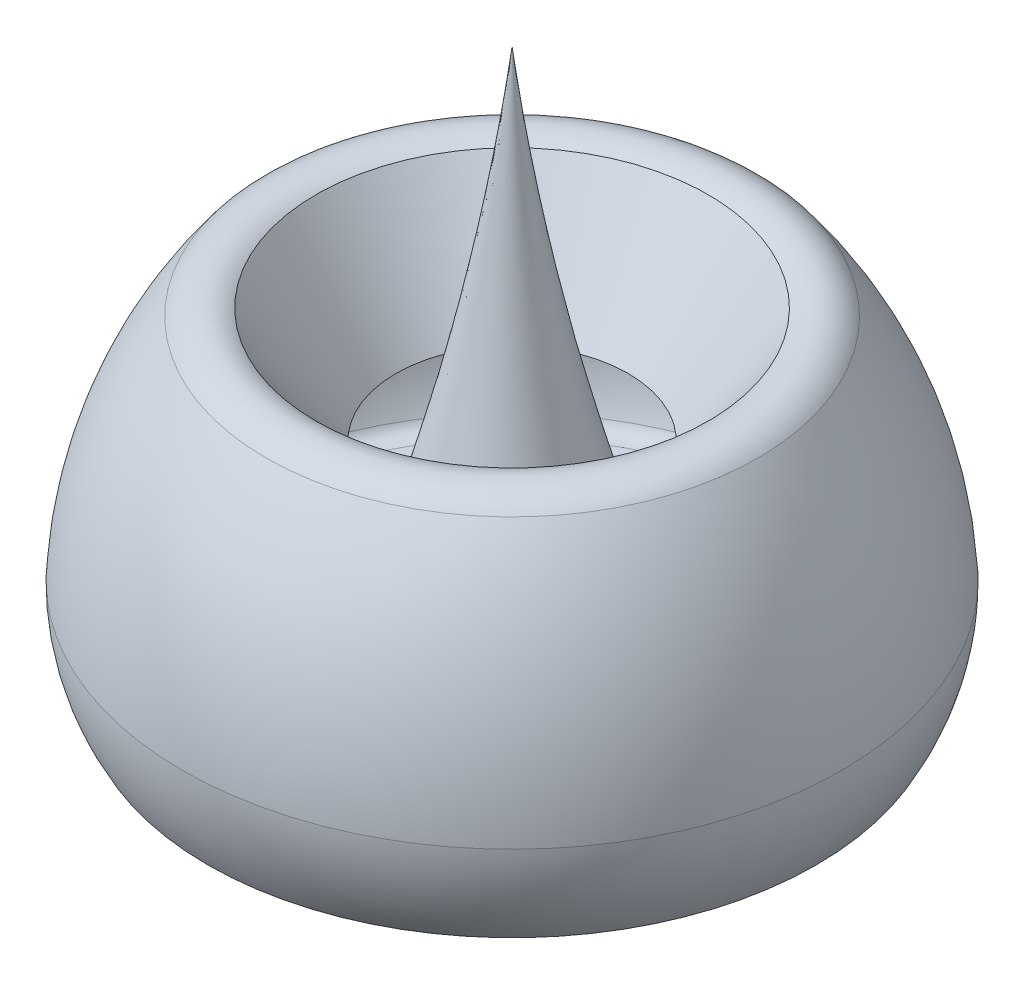
ISO-10303-21;
HEADER;
FILE_DESCRIPTION(('STEP AP214'),'2;1');
FILE_NAME('part.step','',(''),(''),'','','');
FILE_SCHEMA(('AUTOMOTIVE_DESIGN { 1 0 10303 214 1 1 1 1 }'));
ENDSEC;
DATA;
#1=APPLICATION_CONTEXT('core data for automotive mechanical design processes');
#2=APPLICATION_PROTOCOL_DEFINITION('international standard','automotive_design',2000,#1);
#3=PRODUCT_CONTEXT('',#1,'mechanical');
#4=PRODUCT('Part','Part','',(#3));
#5=PRODUCT_RELATED_PRODUCT_CATEGORY('part','',(#4));
#6=PRODUCT_DEFINITION_FORMATION('','',#4);
#7=PRODUCT_DEFINITION_CONTEXT('part definition',#1,'design');
#8=PRODUCT_DEFINITION('design','',#6,#7);
#9=PRODUCT_DEFINITION_SHAPE('','',#8);
#10=(LENGTH_UNIT() NAMED_UNIT(*) SI_UNIT(.MILLI.,.METRE.));
#11=(NAMED_UNIT(*) PLANE_ANGLE_UNIT() SI_UNIT($,.RADIAN.));
#12=(NAMED_UNIT(*) SI_UNIT($,.STERADIAN.) SOLID_ANGLE_UNIT());
#13=UNCERTAINTY_MEASURE_WITH_UNIT(LENGTH_MEASURE(1.E-05),#10,'distance_accuracy_value','');
#14=(GEOMETRIC_REPRESENTATION_CONTEXT(3) GLOBAL_UNCERTAINTY_ASSIGNED_CONTEXT((#13)) GLOBAL_UNIT_ASSIGNED_CONTEXT((#10,
#11,#12)) REPRESENTATION_CONTEXT('',''));
#15=CARTESIAN_POINT('',(0.,0.,0.));
#16=DIRECTION('',(0.,0.,1.));
#17=DIRECTION('',(1.,0.,0.));
#18=AXIS2_PLACEMENT_3D('',#15,#16,#17);
#19=CARTESIAN_POINT('',(0.,34.0455563115203,0.));
#20=DIRECTION('',(0.,1.,0.));
#21=DIRECTION('',(0.,0.,1.));
#22=AXIS2_PLACEMENT_3D('',#19,#20,#21);
#23=TOROIDAL_SURFACE('',#22,24.8884062315712,4.59660149268085);
#24=CARTESIAN_POINT('',(0.,37.1655423101674,0.));
#25=DIRECTION('',(0.,1.,0.));
#26=DIRECTION('',(0.,0.,1.));
#27=AXIS2_PLACEMENT_3D('',#24,#25,#26);
#28=CIRCLE('',#27,28.2639702808467);
#29=CARTESIAN_POINT('',(0.,37.1655423101674,28.2639702808467));
#30=VERTEX_POINT('',#29);
#31=EDGE_CURVE('E72',#30,#30,#28,.T.);
#32=ORIENTED_EDGE('',*,*,#31,.T.);
#33=EDGE_LOOP('',(#32));
#34=FACE_BOUND('',#33,.T.);
#35=CARTESIAN_POINT('',(0.,38.0130302735295,0.));
#36=DIRECTION('',(0.,1.,0.));
#37=DIRECTION('',(0.,0.,1.));
#38=AXIS2_PLACEMENT_3D('',#35,#36,#37);
#39=CIRCLE('',#38,22.5672221278657);
#40=CARTESIAN_POINT('',(0.,38.0130302735295,22.5672221278657));
#41=VERTEX_POINT('',#40);
#42=EDGE_CURVE('E11',#41,#41,#39,.T.);
#43=ORIENTED_EDGE('',*,*,#42,.F.);
#44=EDGE_LOOP('',(#43));
#45=FACE_BOUND('',#44,.T.);
#46=ADVANCED_FACE('F35',(#34,#45),#23,.T.);
#47=CARTESIAN_POINT('',(0.,24.8010951647589,0.));
#48=DIRECTION('',(0.,1.,0.));
#49=DIRECTION('',(0.,0.,1.));
#50=AXIS2_PLACEMENT_3D('',#47,#48,#49);
#51=CONICAL_SURFACE('',#50,13.3589037187226,0.60868930732741);
#52=ORIENTED_EDGE('',*,*,#42,.T.);
#53=EDGE_LOOP('',(#52));
#54=FACE_BOUND('',#53,.T.);
#55=CARTESIAN_POINT('',(0.,24.8010951647589,0.));
#56=DIRECTION('',(0.,1.,0.));
#57=DIRECTION('',(0.,0.,1.));
#58=AXIS2_PLACEMENT_3D('',#55,#56,#57);
#59=CIRCLE('',#58,13.3589037187226);
#60=CARTESIAN_POINT('',(0.,24.8010951647589,13.3589037187226));
#61=VERTEX_POINT('',#60);
#62=EDGE_CURVE('E41',#61,#61,#59,.T.);
#63=ORIENTED_EDGE('',*,*,#62,.F.);
#64=EDGE_LOOP('',(#63));
#65=FACE_BOUND('',#64,.T.);
#66=ADVANCED_FACE('F62',(#54,#65),#51,.F.);
#67=CARTESIAN_POINT('',(0.,24.8010951647589,0.));
#68=DIRECTION('',(0.,-1.,0.));
#69=DIRECTION('',(0.,0.,-1.));
#70=AXIS2_PLACEMENT_3D('',#67,#68,#69);
#71=CONICAL_SURFACE('',#70,13.3589037187226,0.962107019467487);
#72=CARTESIAN_POINT('',(0.,23.6575098413826,0.));
#73=DIRECTION('',(0.,1.,0.));
#74=DIRECTION('',(0.,0.,1.));
#75=AXIS2_PLACEMENT_3D('',#72,#73,#74);
#76=CIRCLE('',#75,14.9997000522626);
#77=CARTESIAN_POINT('',(0.,23.6575098413826,14.9997000522626));
#78=VERTEX_POINT('',#77);
#79=EDGE_CURVE('E78',#78,#78,#76,.T.);
#80=ORIENTED_EDGE('',*,*,#79,.F.);
#81=EDGE_LOOP('',(#80));
#82=FACE_BOUND('',#81,.T.);
#83=ORIENTED_EDGE('',*,*,#62,.T.);
#84=EDGE_LOOP('',(#83));
#85=FACE_BOUND('',#84,.T.);
#86=ADVANCED_FACE('F67',(#82,#85),#71,.F.);
#87=CARTESIAN_POINT('',(0.,29.2206159850857,0.));
#88=DIRECTION('',(0.,1.,0.));
#89=DIRECTION('',(0.,0.,1.));
#90=AXIS2_PLACEMENT_3D('',#87,#88,#89);
#91=CONICAL_SURFACE('',#90,18.8770164554496,0.608689307327411);
#92=ORIENTED_EDGE('',*,*,#79,.T.);
#93=EDGE_LOOP('',(#92));
#94=FACE_BOUND('',#93,.T.);
#95=CARTESIAN_POINT('',(0.,29.2206159850857,0.));
#96=DIRECTION('',(0.,1.,0.));
#97=DIRECTION('',(0.,0.,1.));
#98=AXIS2_PLACEMENT_3D('',#95,#96,#97);
#99=CIRCLE('',#98,18.8770164554496);
#100=CARTESIAN_POINT('',(0.,29.2206159850857,18.8770164554496));
#101=VERTEX_POINT('',#100);
#102=EDGE_CURVE('E80',#101,#101,#99,.T.);
#103=ORIENTED_EDGE('',*,*,#102,.F.);
#104=EDGE_LOOP('',(#103));
#105=FACE_BOUND('',#104,.T.);
#106=ADVANCED_FACE('F179',(#94,#105),#91,.T.);
#107=CARTESIAN_POINT('',(0.,28.0770306617093,0.));
#108=DIRECTION('',(0.,1.,0.));
#109=DIRECTION('',(0.,0.,1.));
#110=AXIS2_PLACEMENT_3D('',#107,#108,#109);
#111=TOROIDAL_SURFACE('',#110,20.5178127889896,2.);
#112=ORIENTED_EDGE('',*,*,#102,.T.);
#113=EDGE_LOOP('',(#112));
#114=FACE_BOUND('',#113,.T.);
#115=CARTESIAN_POINT('',(0.,30.0164674063648,0.));
#116=DIRECTION('',(0.,1.,0.));
#117=DIRECTION('',(0.,0.,1.));
#118=AXIS2_PLACEMENT_3D('',#115,#116,#117);
#119=CIRCLE('',#118,21.0062645404249);
#120=CARTESIAN_POINT('',(0.,30.0164674063648,21.0062645404249));
#121=VERTEX_POINT('',#120);
#122=EDGE_CURVE('E85',#121,#121,#119,.T.);
#123=ORIENTED_EDGE('',*,*,#122,.F.);
#124=EDGE_LOOP('',(#123));
#125=FACE_BOUND('',#124,.T.);
#126=ADVANCED_FACE('F169',(#114,#125),#111,.F.);
#127=CARTESIAN_POINT('',(0.,10.8809474748904,0.));
#128=DIRECTION('',(0.,1.,0.));
#129=DIRECTION('',(0.,0.,1.));
#130=AXIS2_PLACEMENT_3D('',#127,#128,#129);
#131=DEGENERATE_TOROIDAL_SURFACE('',#130,16.1869383876583,19.7330693916227,.T.);
#132=ORIENTED_EDGE('',*,*,#122,.T.);
#133=EDGE_LOOP('',(#132));
#134=FACE_BOUND('',#133,.T.);
#135=CARTESIAN_POINT('',(0.,3.22394174150797,0.));
#136=DIRECTION('',(0.,1.,0.));
#137=DIRECTION('',(0.,0.,1.));
#138=AXIS2_PLACEMENT_3D('',#135,#136,#137);
#139=CIRCLE('',#138,34.3738647583661);
#140=CARTESIAN_POINT('',(0.,3.22394174150797,34.3738647583661));
#141=VERTEX_POINT('',#140);
#142=EDGE_CURVE('E88',#141,#141,#139,.T.);
#143=ORIENTED_EDGE('',*,*,#142,.F.);
#144=EDGE_LOOP('',(#143));
#145=FACE_BOUND('',#144,.T.);
#146=ADVANCED_FACE('F159',(#134,#145),#131,.F.);
#147=CARTESIAN_POINT('',(0.,4.,0.));
#148=DIRECTION('',(0.,1.,0.));
#149=DIRECTION('',(0.,0.,1.));
#150=AXIS2_PLACEMENT_3D('',#147,#148,#149);
#151=TOROIDAL_SURFACE('',#150,32.5305705389246,2.);
#152=CARTESIAN_POINT('',(0.,2.,0.));
#153=DIRECTION('',(0.,1.,0.));
#154=DIRECTION('',(0.,0.,1.));
#155=AXIS2_PLACEMENT_3D('',#152,#153,#154);
#156=CIRCLE('',#155,32.5305705389246);
#157=CARTESIAN_POINT('',(0.,2.,32.5305705389246));
#158=VERTEX_POINT('',#157);
#159=EDGE_CURVE('E91',#158,#158,#156,.T.);
#160=ORIENTED_EDGE('',*,*,#159,.F.);
#161=EDGE_LOOP('',(#160));
#162=FACE_BOUND('',#161,.T.);
#163=ORIENTED_EDGE('',*,*,#142,.T.);
#164=EDGE_LOOP('',(#163));
#165=FACE_BOUND('',#164,.T.);
#166=ADVANCED_FACE('F149',(#162,#165),#151,.F.);
#167=CARTESIAN_POINT('',(0.,2.,0.));
#168=DIRECTION('',(0.,1.,0.));
#169=DIRECTION('',(0.,0.,1.));
#170=AXIS2_PLACEMENT_3D('',#167,#168,#169);
#171=PLANE('',#170);
#172=ORIENTED_EDGE('',*,*,#159,.T.);
#173=EDGE_LOOP('',(#172));
#174=FACE_BOUND('',#173,.T.);
#175=CARTESIAN_POINT('',(0.,2.,0.));
#176=DIRECTION('',(0.,1.,0.));
#177=DIRECTION('',(0.,0.,1.));
#178=AXIS2_PLACEMENT_3D('',#175,#176,#177);
#179=CIRCLE('',#178,16.1869383876583);
#180=CARTESIAN_POINT('',(0.,2.,16.1869383876583));
#181=VERTEX_POINT('',#180);
#182=EDGE_CURVE('E94',#181,#181,#179,.T.);
#183=ORIENTED_EDGE('',*,*,#182,.F.);
#184=EDGE_LOOP('',(#183));
#185=FACE_BOUND('',#184,.T.);
#186=ADVANCED_FACE('F57',(#174,#185),#171,.T.);
#187=CARTESIAN_POINT('',(0.,6.13408177452884,0.));
#188=DIRECTION('',(0.,-1.,0.));
#189=DIRECTION('',(0.,0.,-1.));
#190=AXIS2_PLACEMENT_3D('',#187,#188,#189);
#191=CONICAL_SURFACE('',#190,13.3589037187226,0.599959985509868);
#192=ORIENTED_EDGE('',*,*,#182,.T.);
#193=EDGE_LOOP('',(#192));
#194=FACE_BOUND('',#193,.T.);
#195=CARTESIAN_POINT('',(0.,6.13408177452884,0.));
#196=DIRECTION('',(0.,1.,0.));
#197=DIRECTION('',(0.,0.,1.));
#198=AXIS2_PLACEMENT_3D('',#195,#196,#197);
#199=CIRCLE('',#198,13.3589037187226);
#200=CARTESIAN_POINT('',(0.,6.13408177452884,13.3589037187226));
#201=VERTEX_POINT('',#200);
#202=EDGE_CURVE('E97',#201,#201,#199,.T.);
#203=ORIENTED_EDGE('',*,*,#202,.F.);
#204=EDGE_LOOP('',(#203));
#205=FACE_BOUND('',#204,.T.);
#206=ADVANCED_FACE('F47',(#194,#205),#191,.T.);
#207=CARTESIAN_POINT('',(0.,97.7567206726637,278.391594812072));
#208=DIRECTION('',(-1.,0.,0.));
#209=DIRECTION('',(0.,0.,1.));
#210=AXIS2_PLACEMENT_3D('',#207,#208,#209);
#211=CIRCLE('',#210,280.4229578812);
#212=TRIMMED_CURVE('',#211,(PARAMETER_VALUE(-3.02115438418503)),
(PARAMETER_VALUE(3.02115438418503)),.T.,.PARAMETER.);
#213=CARTESIAN_POINT('',(0.,97.7567206726637,0.));
#214=DIRECTION('',(0.,1.,0.));
#215=AXIS1_PLACEMENT('',#213,#214);
#216=SURFACE_OF_REVOLUTION('',#212,#215);
#217=ORIENTED_EDGE('',*,*,#202,.T.);
#218=EDGE_LOOP('',(#217));
#219=FACE_BOUND('',#218,.T.);
#220=CARTESIAN_POINT('',(0.,64.0646556597869,0.));
#221=VERTEX_POINT('',#220);
#222=VERTEX_LOOP('',#221);
#223=FACE_BOUND('',#222,.T.);
#224=ADVANCED_FACE('F44',(#219,#223),#216,.F.);
#225=CARTESIAN_POINT('',(0.,0.,0.));
#226=DIRECTION('',(0.,1.,0.));
#227=DIRECTION('',(0.,0.,1.));
#228=AXIS2_PLACEMENT_3D('',#225,#226,#227);
#229=PLANE('',#228);
#230=CARTESIAN_POINT('',(0.,0.,0.));
#231=DIRECTION('',(0.,1.,0.));
#232=DIRECTION('',(0.,0.,1.));
#233=AXIS2_PLACEMENT_3D('',#230,#231,#232);
#234=CIRCLE('',#233,35.);
#235=CARTESIAN_POINT('',(0.,0.,35.));
#236=VERTEX_POINT('',#235);
#237=EDGE_CURVE('E99',#236,#236,#234,.T.);
#238=ORIENTED_EDGE('',*,*,#237,.F.);
#239=EDGE_LOOP('',(#238));
#240=FACE_BOUND('',#239,.T.);
#241=ADVANCED_FACE('F46',(#240),#229,.F.);
#242=CARTESIAN_POINT('',(0.,10.8809474748904,0.));
#243=DIRECTION('',(0.,1.,0.));
#244=DIRECTION('',(0.,0.,1.));
#245=AXIS2_PLACEMENT_3D('',#242,#243,#244);
#246=DEGENERATE_TOROIDAL_SURFACE('',#245,16.1869383876583,21.7330693916227,.T.);
#247=CARTESIAN_POINT('',(0.,10.8809474748904,0.));
#248=DIRECTION('',(0.,1.,0.));
#249=DIRECTION('',(0.,0.,1.));
#250=AXIS2_PLACEMENT_3D('',#247,#248,#249);
#251=CIRCLE('',#250,37.920007779281);
#252=CARTESIAN_POINT('',(0.,10.8809474748904,37.920007779281));
#253=VERTEX_POINT('',#252);
#254=EDGE_CURVE('E102',#253,#253,#251,.T.);
#255=ORIENTED_EDGE('',*,*,#254,.F.);
#256=EDGE_LOOP('',(#255));
#257=FACE_BOUND('',#256,.T.);
#258=ORIENTED_EDGE('',*,*,#237,.T.);
#259=EDGE_LOOP('',(#258));
#260=FACE_BOUND('',#259,.T.);
#261=ADVANCED_FACE('F54',(#257,#260),#246,.T.);
#262=CARTESIAN_POINT('',(0.,8.19218394947011,0.));
#263=DIRECTION('',(0.,1.,0.));
#264=DIRECTION('',(0.,0.,1.));
#265=AXIS2_PLACEMENT_3D('',#262,#263,#264);
#266=DEGENERATE_TOROIDAL_SURFACE('',#265,10.0015700792863,47.9969485879088,.F.);
#267=ORIENTED_EDGE('',*,*,#254,.T.);
#268=EDGE_LOOP('',(#267));
#269=FACE_BOUND('',#268,.T.);
#270=ORIENTED_EDGE('',*,*,#31,.F.);
#271=EDGE_LOOP('',(#270));
#272=FACE_BOUND('',#271,.T.);
#273=ADVANCED_FACE('F107',(#269,#272),#266,.F.);
#274=CLOSED_SHELL('',(#46,#66,#86,#106,#126,#146,#166,#186,#206,#224,#241,#261,#273));
#275=MANIFOLD_SOLID_BREP('B2',#274);
#276=ADVANCED_BREP_SHAPE_REPRESENTATION('',(#18,#275),#14);
#277=SHAPE_DEFINITION_REPRESENTATION(#9,#276);
ENDSEC;
END-ISO-10303-21;
